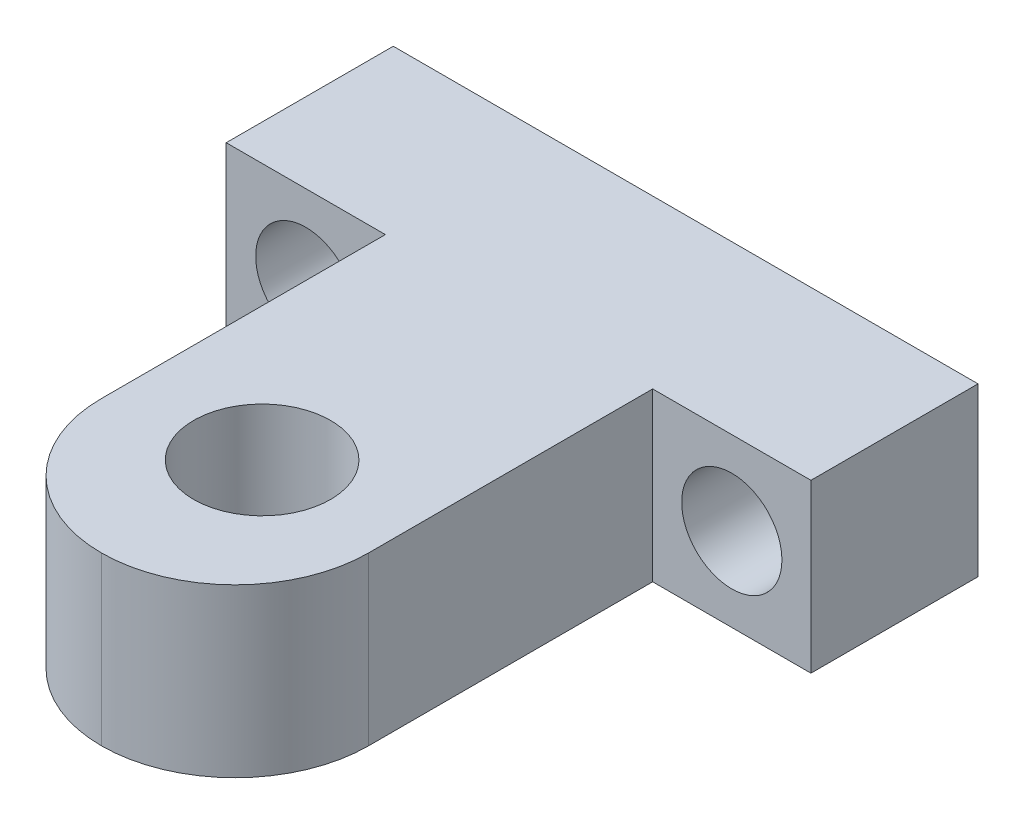
ISO-10303-21;
HEADER;
FILE_DESCRIPTION(('STEP AP214'),'2;1');
FILE_NAME('part.step','',(''),(''),'','','');
FILE_SCHEMA(('AUTOMOTIVE_DESIGN { 1 0 10303 214 1 1 1 1 }'));
ENDSEC;
DATA;
#1=APPLICATION_CONTEXT('core data for automotive mechanical design processes');
#2=APPLICATION_PROTOCOL_DEFINITION('international standard','automotive_design',2000,#1);
#3=PRODUCT_CONTEXT('',#1,'mechanical');
#4=PRODUCT('Part','Part','',(#3));
#5=PRODUCT_RELATED_PRODUCT_CATEGORY('part','',(#4));
#6=PRODUCT_DEFINITION_FORMATION('','',#4);
#7=PRODUCT_DEFINITION_CONTEXT('part definition',#1,'design');
#8=PRODUCT_DEFINITION('design','',#6,#7);
#9=PRODUCT_DEFINITION_SHAPE('','',#8);
#10=(LENGTH_UNIT() NAMED_UNIT(*) SI_UNIT(.MILLI.,.METRE.));
#11=(NAMED_UNIT(*) PLANE_ANGLE_UNIT() SI_UNIT($,.RADIAN.));
#12=(NAMED_UNIT(*) SI_UNIT($,.STERADIAN.) SOLID_ANGLE_UNIT());
#13=UNCERTAINTY_MEASURE_WITH_UNIT(LENGTH_MEASURE(1.E-05),#10,'distance_accuracy_value','');
#14=(GEOMETRIC_REPRESENTATION_CONTEXT(3) GLOBAL_UNCERTAINTY_ASSIGNED_CONTEXT((#13)) GLOBAL_UNIT_ASSIGNED_CONTEXT((#10,
#11,#12)) REPRESENTATION_CONTEXT('',''));
#15=CARTESIAN_POINT('',(0.,0.,0.));
#16=DIRECTION('',(0.,0.,1.));
#17=DIRECTION('',(1.,0.,0.));
#18=AXIS2_PLACEMENT_3D('',#15,#16,#17);
#19=CARTESIAN_POINT('',(12.7099393053223,5.63525769972012,312.507646495262));
#20=DIRECTION('',(0.,0.,1.));
#21=DIRECTION('',(1.,0.,0.));
#22=AXIS2_PLACEMENT_3D('',#19,#20,#21);
#23=CYLINDRICAL_SURFACE('',#22,1.7);
#24=CARTESIAN_POINT('',(12.7099393053223,5.63525769972012,315.507646495262));
#25=DIRECTION('',(0.,0.,1.));
#26=DIRECTION('',(1.,0.,0.));
#27=AXIS2_PLACEMENT_3D('',#24,#25,#26);
#28=CIRCLE('',#27,1.7);
#29=CARTESIAN_POINT('',(14.4099393053223,5.63525769972012,315.507646495262));
#30=VERTEX_POINT('',#29);
#31=EDGE_CURVE('E190',#30,#30,#28,.T.);
#32=CARTESIAN_POINT('',(12.7099393053223,5.63525769972012,319.507646495262));
#33=DIRECTION('',(0.,0.,1.));
#34=DIRECTION('',(1.,0.,0.));
#35=AXIS2_PLACEMENT_3D('',#32,#33,#34);
#36=CIRCLE('',#35,1.7);
#37=CARTESIAN_POINT('',(14.4099393053223,5.63525769972012,319.507646495262));
#38=VERTEX_POINT('',#37);
#39=EDGE_CURVE('E220',#38,#38,#36,.T.);
#40=CARTESIAN_POINT('',(14.4099393053223,5.63525769972012,315.507646495262));
#41=CARTESIAN_POINT('',(14.4099393053223,5.63525769972012,315.549313161929));
#42=CARTESIAN_POINT('',(14.4099393053223,5.63525769972012,315.590979828596));
#43=CARTESIAN_POINT('',(14.4099393053223,5.63525769972012,315.674313161929));
#44=CARTESIAN_POINT('',(14.4099393053223,5.63525769972012,315.715979828596));
#45=CARTESIAN_POINT('',(14.4099393053223,5.63525769972012,315.799313161929));
#46=CARTESIAN_POINT('',(14.4099393053223,5.63525769972012,315.840979828596));
#47=CARTESIAN_POINT('',(14.4099393053223,5.63525769972012,315.924313161929));
#48=CARTESIAN_POINT('',(14.4099393053223,5.63525769972012,315.965979828596));
#49=CARTESIAN_POINT('',(14.4099393053223,5.63525769972012,316.049313161929));
#50=CARTESIAN_POINT('',(14.4099393053223,5.63525769972012,316.090979828596));
#51=CARTESIAN_POINT('',(14.4099393053223,5.63525769972012,316.174313161929));
#52=CARTESIAN_POINT('',(14.4099393053223,5.63525769972012,316.215979828596));
#53=CARTESIAN_POINT('',(14.4099393053223,5.63525769972012,316.299313161929));
#54=CARTESIAN_POINT('',(14.4099393053223,5.63525769972012,316.340979828596));
#55=CARTESIAN_POINT('',(14.4099393053223,5.63525769972012,316.424313161929));
#56=CARTESIAN_POINT('',(14.4099393053223,5.63525769972012,316.465979828596));
#57=CARTESIAN_POINT('',(14.4099393053223,5.63525769972012,316.549313161929));
#58=CARTESIAN_POINT('',(14.4099393053223,5.63525769972012,316.590979828596));
#59=CARTESIAN_POINT('',(14.4099393053223,5.63525769972012,316.674313161929));
#60=CARTESIAN_POINT('',(14.4099393053223,5.63525769972012,316.715979828596));
#61=CARTESIAN_POINT('',(14.4099393053223,5.63525769972012,316.799313161929));
#62=CARTESIAN_POINT('',(14.4099393053223,5.63525769972012,316.840979828596));
#63=CARTESIAN_POINT('',(14.4099393053223,5.63525769972012,316.924313161929));
#64=CARTESIAN_POINT('',(14.4099393053223,5.63525769972012,316.965979828596));
#65=CARTESIAN_POINT('',(14.4099393053223,5.63525769972012,317.049313161929));
#66=CARTESIAN_POINT('',(14.4099393053223,5.63525769972012,317.090979828596));
#67=CARTESIAN_POINT('',(14.4099393053223,5.63525769972012,317.174313161929));
#68=CARTESIAN_POINT('',(14.4099393053223,5.63525769972012,317.215979828596));
#69=CARTESIAN_POINT('',(14.4099393053223,5.63525769972012,317.299313161929));
#70=CARTESIAN_POINT('',(14.4099393053223,5.63525769972012,317.340979828596));
#71=CARTESIAN_POINT('',(14.4099393053223,5.63525769972012,317.424313161929));
#72=CARTESIAN_POINT('',(14.4099393053223,5.63525769972012,317.465979828596));
#73=CARTESIAN_POINT('',(14.4099393053223,5.63525769972012,317.549313161929));
#74=CARTESIAN_POINT('',(14.4099393053223,5.63525769972012,317.590979828596));
#75=CARTESIAN_POINT('',(14.4099393053223,5.63525769972012,317.674313161929));
#76=CARTESIAN_POINT('',(14.4099393053223,5.63525769972012,317.715979828596));
#77=CARTESIAN_POINT('',(14.4099393053223,5.63525769972012,317.799313161929));
#78=CARTESIAN_POINT('',(14.4099393053223,5.63525769972012,317.840979828596));
#79=CARTESIAN_POINT('',(14.4099393053223,5.63525769972012,317.924313161929));
#80=CARTESIAN_POINT('',(14.4099393053223,5.63525769972012,317.965979828596));
#81=CARTESIAN_POINT('',(14.4099393053223,5.63525769972012,318.049313161929));
#82=CARTESIAN_POINT('',(14.4099393053223,5.63525769972012,318.090979828596));
#83=CARTESIAN_POINT('',(14.4099393053223,5.63525769972012,318.174313161929));
#84=CARTESIAN_POINT('',(14.4099393053223,5.63525769972012,318.215979828596));
#85=CARTESIAN_POINT('',(14.4099393053223,5.63525769972012,318.299313161929));
#86=CARTESIAN_POINT('',(14.4099393053223,5.63525769972012,318.340979828596));
#87=CARTESIAN_POINT('',(14.4099393053223,5.63525769972012,318.424313161929));
#88=CARTESIAN_POINT('',(14.4099393053223,5.63525769972012,318.465979828596));
#89=CARTESIAN_POINT('',(14.4099393053223,5.63525769972012,318.549313161929));
#90=CARTESIAN_POINT('',(14.4099393053223,5.63525769972012,318.590979828596));
#91=CARTESIAN_POINT('',(14.4099393053223,5.63525769972012,318.674313161929));
#92=CARTESIAN_POINT('',(14.4099393053223,5.63525769972012,318.715979828596));
#93=CARTESIAN_POINT('',(14.4099393053223,5.63525769972012,318.799313161929));
#94=CARTESIAN_POINT('',(14.4099393053223,5.63525769972012,318.840979828596));
#95=CARTESIAN_POINT('',(14.4099393053223,5.63525769972012,318.924313161929));
#96=CARTESIAN_POINT('',(14.4099393053223,5.63525769972012,318.965979828596));
#97=CARTESIAN_POINT('',(14.4099393053223,5.63525769972012,319.049313161929));
#98=CARTESIAN_POINT('',(14.4099393053223,5.63525769972012,319.090979828596));
#99=CARTESIAN_POINT('',(14.4099393053223,5.63525769972012,319.174313161929));
#100=CARTESIAN_POINT('',(14.4099393053223,5.63525769972012,319.215979828596));
#101=CARTESIAN_POINT('',(14.4099393053223,5.63525769972012,319.299313161929));
#102=CARTESIAN_POINT('',(14.4099393053223,5.63525769972012,319.340979828596));
#103=CARTESIAN_POINT('',(14.4099393053223,5.63525769972012,319.424313161929));
#104=CARTESIAN_POINT('',(14.4099393053223,5.63525769972012,319.465979828596));
#105=CARTESIAN_POINT('',(14.4099393053223,5.63525769972012,319.507646495262));
#106=B_SPLINE_CURVE_WITH_KNOTS('',3,(#40,#41,#42,#43,#44,#45,#46,#47,#48,#49,#50,#51,#52,#53,
#54,#55,#56,#57,#58,#59,#60,#61,#62,#63,#64,#65,#66,#67,#68,#69,#70,#71,#72,#73,#74,#75,#76,#77,
#78,#79,#80,#81,#82,#83,#84,#85,#86,#87,#88,#89,#90,#91,#92,#93,#94,#95,#96,#97,#98,#99,#100,
#101,#102,#103,#104,#105),.UNSPECIFIED.,.F.,.F.,(4,2,2,2,2,2,2,2,2,2,2,2,2,2,2,2,2,2,2,2,2,2,2,
2,2,2,2,2,2,2,2,2,4),(0.,0.125000000000042,0.250000000000028,0.375000000000014,0.5,
0.625000000000042,0.750000000000028,0.875000000000015,1.,1.12500000000004,1.25000000000003,
1.37500000000002,1.5,1.62500000000004,1.75000000000003,1.87500000000002,2.,2.12500000000004,
2.25000000000003,2.37500000000002,2.5,2.62500000000004,2.75000000000003,2.87500000000002,3.,
3.12500000000004,3.25000000000003,3.37500000000002,3.5,3.62500000000004,3.75000000000003,
3.87500000000002,4.),.UNSPECIFIED.);
#107=EDGE_CURVE('BSEAM58',#30,#38,#106,.T.);
#108=ORIENTED_EDGE('',*,*,#31,.F.);
#109=ORIENTED_EDGE('',*,*,#39,.T.);
#110=ORIENTED_EDGE('',*,*,#107,.T.);
#111=ORIENTED_EDGE('',*,*,#107,.F.);
#112=EDGE_LOOP('',(#108,#110,#109,#111));
#113=FACE_BOUND('',#112,.T.);
#114=ADVANCED_FACE('F58',(#113),#23,.F.);
#115=CARTESIAN_POINT('',(-12.7900606946777,5.63525769972012,312.507646495262));
#116=DIRECTION('',(0.,0.,1.));
#117=DIRECTION('',(1.,0.,0.));
#118=AXIS2_PLACEMENT_3D('',#115,#116,#117);
#119=CYLINDRICAL_SURFACE('',#118,1.7);
#120=CARTESIAN_POINT('',(-12.7900606946777,5.63525769972012,315.507646495262));
#121=DIRECTION('',(0.,0.,1.));
#122=DIRECTION('',(1.,0.,0.));
#123=AXIS2_PLACEMENT_3D('',#120,#121,#122);
#124=CIRCLE('',#123,1.7);
#125=CARTESIAN_POINT('',(-11.0900606946777,5.63525769972012,315.507646495262));
#126=VERTEX_POINT('',#125);
#127=EDGE_CURVE('E193',#126,#126,#124,.T.);
#128=CARTESIAN_POINT('',(-12.7900606946777,5.63525769972012,319.507646495262));
#129=DIRECTION('',(0.,0.,1.));
#130=DIRECTION('',(1.,0.,0.));
#131=AXIS2_PLACEMENT_3D('',#128,#129,#130);
#132=CIRCLE('',#131,1.7);
#133=CARTESIAN_POINT('',(-11.0900606946777,5.63525769972012,319.507646495262));
#134=VERTEX_POINT('',#133);
#135=EDGE_CURVE('E290',#134,#134,#132,.F.);
#136=CARTESIAN_POINT('',(-11.0900606946777,5.63525769972012,315.507646495262));
#137=CARTESIAN_POINT('',(-11.0900606946777,5.63525769972012,315.549313161929));
#138=CARTESIAN_POINT('',(-11.0900606946777,5.63525769972012,315.590979828596));
#139=CARTESIAN_POINT('',(-11.0900606946777,5.63525769972012,315.674313161929));
#140=CARTESIAN_POINT('',(-11.0900606946777,5.63525769972012,315.715979828596));
#141=CARTESIAN_POINT('',(-11.0900606946777,5.63525769972012,315.799313161929));
#142=CARTESIAN_POINT('',(-11.0900606946777,5.63525769972012,315.840979828596));
#143=CARTESIAN_POINT('',(-11.0900606946777,5.63525769972012,315.924313161929));
#144=CARTESIAN_POINT('',(-11.0900606946777,5.63525769972012,315.965979828596));
#145=CARTESIAN_POINT('',(-11.0900606946777,5.63525769972012,316.049313161929));
#146=CARTESIAN_POINT('',(-11.0900606946777,5.63525769972012,316.090979828596));
#147=CARTESIAN_POINT('',(-11.0900606946777,5.63525769972012,316.174313161929));
#148=CARTESIAN_POINT('',(-11.0900606946777,5.63525769972012,316.215979828596));
#149=CARTESIAN_POINT('',(-11.0900606946777,5.63525769972012,316.299313161929));
#150=CARTESIAN_POINT('',(-11.0900606946777,5.63525769972012,316.340979828596));
#151=CARTESIAN_POINT('',(-11.0900606946777,5.63525769972012,316.424313161929));
#152=CARTESIAN_POINT('',(-11.0900606946777,5.63525769972012,316.465979828596));
#153=CARTESIAN_POINT('',(-11.0900606946777,5.63525769972012,316.549313161929));
#154=CARTESIAN_POINT('',(-11.0900606946777,5.63525769972012,316.590979828596));
#155=CARTESIAN_POINT('',(-11.0900606946777,5.63525769972012,316.674313161929));
#156=CARTESIAN_POINT('',(-11.0900606946777,5.63525769972012,316.715979828596));
#157=CARTESIAN_POINT('',(-11.0900606946777,5.63525769972012,316.799313161929));
#158=CARTESIAN_POINT('',(-11.0900606946777,5.63525769972012,316.840979828596));
#159=CARTESIAN_POINT('',(-11.0900606946777,5.63525769972012,316.924313161929));
#160=CARTESIAN_POINT('',(-11.0900606946777,5.63525769972012,316.965979828596));
#161=CARTESIAN_POINT('',(-11.0900606946777,5.63525769972012,317.049313161929));
#162=CARTESIAN_POINT('',(-11.0900606946777,5.63525769972012,317.090979828596));
#163=CARTESIAN_POINT('',(-11.0900606946777,5.63525769972012,317.174313161929));
#164=CARTESIAN_POINT('',(-11.0900606946777,5.63525769972012,317.215979828596));
#165=CARTESIAN_POINT('',(-11.0900606946777,5.63525769972012,317.299313161929));
#166=CARTESIAN_POINT('',(-11.0900606946777,5.63525769972012,317.340979828596));
#167=CARTESIAN_POINT('',(-11.0900606946777,5.63525769972012,317.424313161929));
#168=CARTESIAN_POINT('',(-11.0900606946777,5.63525769972012,317.465979828596));
#169=CARTESIAN_POINT('',(-11.0900606946777,5.63525769972012,317.549313161929));
#170=CARTESIAN_POINT('',(-11.0900606946777,5.63525769972012,317.590979828596));
#171=CARTESIAN_POINT('',(-11.0900606946777,5.63525769972012,317.674313161929));
#172=CARTESIAN_POINT('',(-11.0900606946777,5.63525769972012,317.715979828596));
#173=CARTESIAN_POINT('',(-11.0900606946777,5.63525769972012,317.799313161929));
#174=CARTESIAN_POINT('',(-11.0900606946777,5.63525769972012,317.840979828596));
#175=CARTESIAN_POINT('',(-11.0900606946777,5.63525769972012,317.924313161929));
#176=CARTESIAN_POINT('',(-11.0900606946777,5.63525769972012,317.965979828596));
#177=CARTESIAN_POINT('',(-11.0900606946777,5.63525769972012,318.049313161929));
#178=CARTESIAN_POINT('',(-11.0900606946777,5.63525769972012,318.090979828596));
#179=CARTESIAN_POINT('',(-11.0900606946777,5.63525769972012,318.174313161929));
#180=CARTESIAN_POINT('',(-11.0900606946777,5.63525769972012,318.215979828596));
#181=CARTESIAN_POINT('',(-11.0900606946777,5.63525769972012,318.299313161929));
#182=CARTESIAN_POINT('',(-11.0900606946777,5.63525769972012,318.340979828596));
#183=CARTESIAN_POINT('',(-11.0900606946777,5.63525769972012,318.424313161929));
#184=CARTESIAN_POINT('',(-11.0900606946777,5.63525769972012,318.465979828596));
#185=CARTESIAN_POINT('',(-11.0900606946777,5.63525769972012,318.549313161929));
#186=CARTESIAN_POINT('',(-11.0900606946777,5.63525769972012,318.590979828596));
#187=CARTESIAN_POINT('',(-11.0900606946777,5.63525769972012,318.674313161929));
#188=CARTESIAN_POINT('',(-11.0900606946777,5.63525769972012,318.715979828596));
#189=CARTESIAN_POINT('',(-11.0900606946777,5.63525769972012,318.799313161929));
#190=CARTESIAN_POINT('',(-11.0900606946777,5.63525769972012,318.840979828596));
#191=CARTESIAN_POINT('',(-11.0900606946777,5.63525769972012,318.924313161929));
#192=CARTESIAN_POINT('',(-11.0900606946777,5.63525769972012,318.965979828596));
#193=CARTESIAN_POINT('',(-11.0900606946777,5.63525769972012,319.049313161929));
#194=CARTESIAN_POINT('',(-11.0900606946777,5.63525769972012,319.090979828596));
#195=CARTESIAN_POINT('',(-11.0900606946777,5.63525769972012,319.174313161929));
#196=CARTESIAN_POINT('',(-11.0900606946777,5.63525769972012,319.215979828596));
#197=CARTESIAN_POINT('',(-11.0900606946777,5.63525769972012,319.299313161929));
#198=CARTESIAN_POINT('',(-11.0900606946777,5.63525769972012,319.340979828596));
#199=CARTESIAN_POINT('',(-11.0900606946777,5.63525769972012,319.424313161929));
#200=CARTESIAN_POINT('',(-11.0900606946777,5.63525769972012,319.465979828596));
#201=CARTESIAN_POINT('',(-11.0900606946777,5.63525769972012,319.507646495262));
#202=B_SPLINE_CURVE_WITH_KNOTS('',3,(#136,#137,#138,#139,#140,#141,#142,#143,#144,#145,#146,
#147,#148,#149,#150,#151,#152,#153,#154,#155,#156,#157,#158,#159,#160,#161,#162,#163,#164,#165,
#166,#167,#168,#169,#170,#171,#172,#173,#174,#175,#176,#177,#178,#179,#180,#181,#182,#183,#184,
#185,#186,#187,#188,#189,#190,#191,#192,#193,#194,#195,#196,#197,#198,#199,#200,#201),
.UNSPECIFIED.,.F.,.F.,(4,2,2,2,2,2,2,2,2,2,2,2,2,2,2,2,2,2,2,2,2,2,2,2,2,2,2,2,2,2,2,2,4),(0.,
0.125000000000042,0.250000000000028,0.375000000000014,0.5,0.625000000000042,0.750000000000028,
0.875000000000015,1.,1.12500000000004,1.25000000000003,1.37500000000002,1.5,1.62500000000004,
1.75000000000003,1.87500000000002,2.,2.12500000000004,2.25000000000003,2.37500000000002,2.5,
2.62500000000004,2.75000000000003,2.87500000000002,3.,3.12500000000004,3.25000000000003,
3.37500000000002,3.5,3.62500000000004,3.75000000000003,3.87500000000002,4.),.UNSPECIFIED.);
#203=EDGE_CURVE('BSEAM257',#126,#134,#202,.T.);
#204=ORIENTED_EDGE('',*,*,#127,.F.);
#205=ORIENTED_EDGE('',*,*,#135,.F.);
#206=ORIENTED_EDGE('',*,*,#203,.T.);
#207=ORIENTED_EDGE('',*,*,#203,.F.);
#208=EDGE_LOOP('',(#204,#206,#205,#207));
#209=FACE_BOUND('',#208,.T.);
#210=ADVANCED_FACE('F257',(#209),#119,.F.);
#211=CARTESIAN_POINT('',(0.,0.,325.507646495262));
#212=DIRECTION('',(0.,0.,1.));
#213=DIRECTION('',(1.,0.,0.));
#214=AXIS2_PLACEMENT_3D('',#211,#212,#213);
#215=PLANE('',#214);
#216=CARTESIAN_POINT('',(12.7099393053223,5.63525769972012,325.507646495262));
#217=DIRECTION('',(0.,0.,1.));
#218=DIRECTION('',(1.,0.,0.));
#219=AXIS2_PLACEMENT_3D('',#216,#217,#218);
#220=CIRCLE('',#219,3.);
#221=CARTESIAN_POINT('',(15.7099393053223,5.63525769972012,325.507646495262));
#222=VERTEX_POINT('',#221);
#223=EDGE_CURVE('E218',#222,#222,#220,.T.);
#224=ORIENTED_EDGE('',*,*,#223,.F.);
#225=EDGE_LOOP('',(#224));
#226=FACE_BOUND('',#225,.T.);
#227=DIRECTION('',(1.,0.,0.));
#228=VECTOR('',#227,1.);
#229=CARTESIAN_POINT('',(0.,10.6352576997201,325.507646495262));
#230=LINE('',#229,#228);
#231=CARTESIAN_POINT('',(7.97329287021489,10.6352576997201,325.507646495262));
#232=VERTEX_POINT('',#231);
#233=CARTESIAN_POINT('',(17.4465857404298,10.6352576997201,325.507646495262));
#234=VERTEX_POINT('',#233);
#235=EDGE_CURVE('E164',#232,#234,#230,.T.);
#236=ORIENTED_EDGE('',*,*,#235,.F.);
#237=DIRECTION('',(0.,-1.,0.));
#238=VECTOR('',#237,1.);
#239=CARTESIAN_POINT('',(7.97329287021489,0.,325.507646495262));
#240=LINE('',#239,#238);
#241=CARTESIAN_POINT('',(7.97329287021489,0.635257699720115,325.507646495262));
#242=VERTEX_POINT('',#241);
#243=EDGE_CURVE('E160',#232,#242,#240,.T.);
#244=ORIENTED_EDGE('',*,*,#243,.T.);
#245=DIRECTION('',(1.,0.,0.));
#246=VECTOR('',#245,1.);
#247=CARTESIAN_POINT('',(0.,0.635257699720115,325.507646495262));
#248=LINE('',#247,#246);
#249=CARTESIAN_POINT('',(17.4465857404298,0.635257699720115,325.507646495262));
#250=VERTEX_POINT('',#249);
#251=EDGE_CURVE('E148',#242,#250,#248,.T.);
#252=ORIENTED_EDGE('',*,*,#251,.T.);
#253=DIRECTION('',(0.,1.,0.));
#254=VECTOR('',#253,1.);
#255=CARTESIAN_POINT('',(17.4465857404298,0.,325.507646495262));
#256=LINE('',#255,#254);
#257=EDGE_CURVE('E147',#250,#234,#256,.T.);
#258=ORIENTED_EDGE('',*,*,#257,.T.);
#259=EDGE_LOOP('',(#236,#244,#252,#258));
#260=FACE_BOUND('',#259,.T.);
#261=ADVANCED_FACE('F232',(#226,#260),#215,.T.);
#262=CARTESIAN_POINT('',(0.,0.635257699720115,325.507646495262));
#263=DIRECTION('',(0.,1.,0.));
#264=DIRECTION('',(0.,0.,1.));
#265=AXIS2_PLACEMENT_3D('',#262,#263,#264);
#266=PLANE('',#265);
#267=DIRECTION('',(0.,0.,-1.));
#268=VECTOR('',#267,1.);
#269=CARTESIAN_POINT('',(7.97329287021489,0.635257699720115,350.507646495262));
#270=LINE('',#269,#268);
#271=CARTESIAN_POINT('',(7.97329287021489,0.635257699720115,342.507646495262));
#272=VERTEX_POINT('',#271);
#273=EDGE_CURVE('E214',#272,#242,#270,.T.);
#274=ORIENTED_EDGE('',*,*,#273,.F.);
#275=CARTESIAN_POINT('',(-0.0267071297851139,0.635257699720115,342.507646495262));
#276=DIRECTION('',(0.,1.,0.));
#277=DIRECTION('',(0.,0.,1.));
#278=AXIS2_PLACEMENT_3D('',#275,#276,#277);
#279=CIRCLE('',#278,8.);
#280=CARTESIAN_POINT('',(-0.026707129785114,0.635257699720115,350.507646495262));
#281=VERTEX_POINT('',#280);
#282=EDGE_CURVE('E200',#272,#281,#279,.F.);
#283=ORIENTED_EDGE('',*,*,#282,.T.);
#284=CARTESIAN_POINT('',(-0.026707129785114,0.635257699720115,342.507646495262));
#285=DIRECTION('',(0.,1.,0.));
#286=DIRECTION('',(0.,0.,1.));
#287=AXIS2_PLACEMENT_3D('',#284,#285,#286);
#288=CIRCLE('',#287,8.);
#289=CARTESIAN_POINT('',(-8.02670712978511,0.635257699720115,342.507646495262));
#290=VERTEX_POINT('',#289);
#291=EDGE_CURVE('E135',#281,#290,#288,.F.);
#292=ORIENTED_EDGE('',*,*,#291,.T.);
#293=DIRECTION('',(0.,0.,-1.));
#294=VECTOR('',#293,1.);
#295=CARTESIAN_POINT('',(-8.02670712978511,0.635257699720115,350.507646495262));
#296=LINE('',#295,#294);
#297=CARTESIAN_POINT('',(-8.02670712978511,0.635257699720115,325.507646495262));
#298=VERTEX_POINT('',#297);
#299=EDGE_CURVE('E128',#290,#298,#296,.T.);
#300=ORIENTED_EDGE('',*,*,#299,.T.);
#301=CARTESIAN_POINT('',(-17.5534142595702,0.635257699720115,325.507646495262));
#302=VERTEX_POINT('',#301);
#303=EDGE_CURVE('E132',#302,#298,#248,.T.);
#304=ORIENTED_EDGE('',*,*,#303,.F.);
#305=DIRECTION('',(0.,0.,-1.));
#306=VECTOR('',#305,1.);
#307=CARTESIAN_POINT('',(-17.5534142595702,0.635257699720115,325.507646495262));
#308=LINE('',#307,#306);
#309=CARTESIAN_POINT('',(-17.5534142595702,0.635257699720115,315.507646495262));
#310=VERTEX_POINT('',#309);
#311=EDGE_CURVE('E168',#302,#310,#308,.T.);
#312=ORIENTED_EDGE('',*,*,#311,.T.);
#313=DIRECTION('',(1.,0.,0.));
#314=VECTOR('',#313,1.);
#315=CARTESIAN_POINT('',(0.,0.635257699720115,315.507646495262));
#316=LINE('',#315,#314);
#317=CARTESIAN_POINT('',(17.4465857404298,0.635257699720115,315.507646495262));
#318=VERTEX_POINT('',#317);
#319=EDGE_CURVE('E169',#310,#318,#316,.T.);
#320=ORIENTED_EDGE('',*,*,#319,.T.);
#321=DIRECTION('',(0.,0.,-1.));
#322=VECTOR('',#321,1.);
#323=CARTESIAN_POINT('',(17.4465857404298,0.635257699720115,325.507646495262));
#324=LINE('',#323,#322);
#325=EDGE_CURVE('E186',#250,#318,#324,.T.);
#326=ORIENTED_EDGE('',*,*,#325,.F.);
#327=ORIENTED_EDGE('',*,*,#251,.F.);
#328=EDGE_LOOP('',(#274,#283,#292,#300,#304,#312,#320,#326,#327));
#329=FACE_BOUND('',#328,.T.);
#330=ADVANCED_FACE('F131',(#329),#266,.F.);
#331=CARTESIAN_POINT('',(17.4465857404298,0.,325.507646495262));
#332=DIRECTION('',(-1.,0.,0.));
#333=DIRECTION('',(0.,0.,1.));
#334=AXIS2_PLACEMENT_3D('',#331,#332,#333);
#335=PLANE('',#334);
#336=DIRECTION('',(0.,1.,0.));
#337=VECTOR('',#336,1.);
#338=CARTESIAN_POINT('',(17.4465857404298,0.,315.507646495262));
#339=LINE('',#338,#337);
#340=CARTESIAN_POINT('',(17.4465857404298,10.6352576997201,315.507646495262));
#341=VERTEX_POINT('',#340);
#342=EDGE_CURVE('E172',#318,#341,#339,.T.);
#343=ORIENTED_EDGE('',*,*,#342,.T.);
#344=DIRECTION('',(0.,0.,-1.));
#345=VECTOR('',#344,1.);
#346=CARTESIAN_POINT('',(17.4465857404298,10.6352576997201,325.507646495262));
#347=LINE('',#346,#345);
#348=EDGE_CURVE('E184',#234,#341,#347,.T.);
#349=ORIENTED_EDGE('',*,*,#348,.F.);
#350=ORIENTED_EDGE('',*,*,#257,.F.);
#351=ORIENTED_EDGE('',*,*,#325,.T.);
#352=EDGE_LOOP('',(#343,#349,#350,#351));
#353=FACE_BOUND('',#352,.T.);
#354=ADVANCED_FACE('F237',(#353),#335,.F.);
#355=CARTESIAN_POINT('',(0.,10.6352576997201,325.507646495262));
#356=DIRECTION('',(0.,1.,0.));
#357=DIRECTION('',(0.,0.,1.));
#358=AXIS2_PLACEMENT_3D('',#355,#356,#357);
#359=PLANE('',#358);
#360=CARTESIAN_POINT('',(-0.0340554057802755,10.6352576997201,340.877646495262));
#361=DIRECTION('',(0.,1.,0.));
#362=DIRECTION('',(0.,0.,1.));
#363=AXIS2_PLACEMENT_3D('',#360,#361,#362);
#364=CIRCLE('',#363,4.09999999999999);
#365=CARTESIAN_POINT('',(-0.0340554057802755,10.6352576997201,344.977646495262));
#366=VERTEX_POINT('',#365);
#367=EDGE_CURVE('E154',#366,#366,#364,.T.);
#368=ORIENTED_EDGE('',*,*,#367,.F.);
#369=EDGE_LOOP('',(#368));
#370=FACE_BOUND('',#369,.T.);
#371=CARTESIAN_POINT('',(-0.0267071297851158,10.6352576997201,342.507646495262));
#372=DIRECTION('',(0.,1.,0.));
#373=DIRECTION('',(0.,0.,1.));
#374=AXIS2_PLACEMENT_3D('',#371,#372,#373);
#375=CIRCLE('',#374,8.);
#376=CARTESIAN_POINT('',(-8.02670712978512,10.6352576997201,342.507646495262));
#377=VERTEX_POINT('',#376);
#378=CARTESIAN_POINT('',(-0.0267071297851158,10.6352576997201,350.507646495262));
#379=VERTEX_POINT('',#378);
#380=EDGE_CURVE('E74',#377,#379,#375,.T.);
#381=ORIENTED_EDGE('',*,*,#380,.T.);
#382=CARTESIAN_POINT('',(-0.0267071297851122,10.6352576997201,342.507646495262));
#383=DIRECTION('',(0.,1.,0.));
#384=DIRECTION('',(0.,0.,1.));
#385=AXIS2_PLACEMENT_3D('',#382,#383,#384);
#386=CIRCLE('',#385,8.);
#387=CARTESIAN_POINT('',(7.97329287021489,10.6352576997201,342.507646495262));
#388=VERTEX_POINT('',#387);
#389=EDGE_CURVE('E67',#379,#388,#386,.T.);
#390=ORIENTED_EDGE('',*,*,#389,.T.);
#391=DIRECTION('',(0.,0.,-1.));
#392=VECTOR('',#391,1.);
#393=CARTESIAN_POINT('',(7.97329287021489,10.6352576997201,350.507646495262));
#394=LINE('',#393,#392);
#395=EDGE_CURVE('E158',#388,#232,#394,.T.);
#396=ORIENTED_EDGE('',*,*,#395,.T.);
#397=ORIENTED_EDGE('',*,*,#235,.T.);
#398=ORIENTED_EDGE('',*,*,#348,.T.);
#399=DIRECTION('',(1.,0.,0.));
#400=VECTOR('',#399,1.);
#401=CARTESIAN_POINT('',(0.,10.6352576997201,315.507646495262));
#402=LINE('',#401,#400);
#403=CARTESIAN_POINT('',(-17.5534142595702,10.6352576997201,315.507646495262));
#404=VERTEX_POINT('',#403);
#405=EDGE_CURVE('E175',#404,#341,#402,.T.);
#406=ORIENTED_EDGE('',*,*,#405,.F.);
#407=DIRECTION('',(0.,0.,-1.));
#408=VECTOR('',#407,1.);
#409=CARTESIAN_POINT('',(-17.5534142595702,10.6352576997201,325.507646495262));
#410=LINE('',#409,#408);
#411=CARTESIAN_POINT('',(-17.5534142595702,10.6352576997201,325.507646495262));
#412=VERTEX_POINT('',#411);
#413=EDGE_CURVE('E182',#412,#404,#410,.T.);
#414=ORIENTED_EDGE('',*,*,#413,.F.);
#415=CARTESIAN_POINT('',(-8.02670712978511,10.6352576997201,325.507646495262));
#416=VERTEX_POINT('',#415);
#417=EDGE_CURVE('E165',#412,#416,#230,.T.);
#418=ORIENTED_EDGE('',*,*,#417,.T.);
#419=DIRECTION('',(0.,0.,-1.));
#420=VECTOR('',#419,1.);
#421=CARTESIAN_POINT('',(-8.02670712978512,10.6352576997201,350.507646495262));
#422=LINE('',#421,#420);
#423=EDGE_CURVE('E137',#377,#416,#422,.T.);
#424=ORIENTED_EDGE('',*,*,#423,.F.);
#425=EDGE_LOOP('',(#381,#390,#396,#397,#398,#406,#414,#418,#424));
#426=FACE_BOUND('',#425,.T.);
#427=ADVANCED_FACE('F205',(#370,#426),#359,.T.);
#428=CARTESIAN_POINT('',(-17.5534142595702,0.,325.507646495262));
#429=DIRECTION('',(-1.,0.,0.));
#430=DIRECTION('',(0.,-1.,0.));
#431=AXIS2_PLACEMENT_3D('',#428,#429,#430);
#432=PLANE('',#431);
#433=DIRECTION('',(0.,1.,0.));
#434=VECTOR('',#433,1.);
#435=CARTESIAN_POINT('',(-17.5534142595702,0.,315.507646495262));
#436=LINE('',#435,#434);
#437=EDGE_CURVE('E178',#310,#404,#436,.T.);
#438=ORIENTED_EDGE('',*,*,#437,.F.);
#439=ORIENTED_EDGE('',*,*,#311,.F.);
#440=DIRECTION('',(0.,1.,0.));
#441=VECTOR('',#440,1.);
#442=CARTESIAN_POINT('',(-17.5534142595702,0.,325.507646495262));
#443=LINE('',#442,#441);
#444=EDGE_CURVE('E146',#302,#412,#443,.T.);
#445=ORIENTED_EDGE('',*,*,#444,.T.);
#446=ORIENTED_EDGE('',*,*,#413,.T.);
#447=EDGE_LOOP('',(#438,#439,#445,#446));
#448=FACE_BOUND('',#447,.T.);
#449=ADVANCED_FACE('F244',(#448),#432,.T.);
#450=CARTESIAN_POINT('',(-12.7900606946777,5.63525769972012,325.507646495262));
#451=DIRECTION('',(0.,0.,1.));
#452=DIRECTION('',(1.,0.,0.));
#453=AXIS2_PLACEMENT_3D('',#450,#451,#452);
#454=CIRCLE('',#453,3.);
#455=CARTESIAN_POINT('',(-9.79006069467768,5.63525769972012,325.507646495262));
#456=VERTEX_POINT('',#455);
#457=EDGE_CURVE('E292',#456,#456,#454,.T.);
#458=ORIENTED_EDGE('',*,*,#457,.F.);
#459=EDGE_LOOP('',(#458));
#460=FACE_BOUND('',#459,.T.);
#461=DIRECTION('',(0.,-1.,0.));
#462=VECTOR('',#461,1.);
#463=CARTESIAN_POINT('',(-8.02670712978512,10.6352576997201,325.507646495262));
#464=LINE('',#463,#462);
#465=EDGE_CURVE('E138',#416,#298,#464,.T.);
#466=ORIENTED_EDGE('',*,*,#465,.F.);
#467=ORIENTED_EDGE('',*,*,#417,.F.);
#468=ORIENTED_EDGE('',*,*,#444,.F.);
#469=ORIENTED_EDGE('',*,*,#303,.T.);
#470=EDGE_LOOP('',(#466,#467,#468,#469));
#471=FACE_BOUND('',#470,.T.);
#472=ADVANCED_FACE('F142',(#460,#471),#215,.T.);
#473=CARTESIAN_POINT('',(0.,0.,315.507646495262));
#474=DIRECTION('',(0.,0.,1.));
#475=DIRECTION('',(1.,0.,0.));
#476=AXIS2_PLACEMENT_3D('',#473,#474,#475);
#477=PLANE('',#476);
#478=ORIENTED_EDGE('',*,*,#127,.T.);
#479=EDGE_LOOP('',(#478));
#480=FACE_BOUND('',#479,.T.);
#481=ORIENTED_EDGE('',*,*,#31,.T.);
#482=EDGE_LOOP('',(#481));
#483=FACE_BOUND('',#482,.T.);
#484=ORIENTED_EDGE('',*,*,#319,.F.);
#485=ORIENTED_EDGE('',*,*,#437,.T.);
#486=ORIENTED_EDGE('',*,*,#405,.T.);
#487=ORIENTED_EDGE('',*,*,#342,.F.);
#488=EDGE_LOOP('',(#484,#485,#486,#487));
#489=FACE_BOUND('',#488,.T.);
#490=ADVANCED_FACE('F242',(#480,#483,#489),#477,.F.);
#491=CARTESIAN_POINT('',(7.97329287021489,0.,350.507646495262));
#492=DIRECTION('',(1.,0.,0.));
#493=DIRECTION('',(0.,1.,0.));
#494=AXIS2_PLACEMENT_3D('',#491,#492,#493);
#495=PLANE('',#494);
#496=ORIENTED_EDGE('',*,*,#395,.F.);
#497=DIRECTION('',(0.,-1.,0.));
#498=VECTOR('',#497,1.);
#499=CARTESIAN_POINT('',(7.97329287021489,0.,342.507646495262));
#500=LINE('',#499,#498);
#501=EDGE_CURVE('E189',#388,#272,#500,.T.);
#502=ORIENTED_EDGE('',*,*,#501,.T.);
#503=ORIENTED_EDGE('',*,*,#273,.T.);
#504=ORIENTED_EDGE('',*,*,#243,.F.);
#505=EDGE_LOOP('',(#496,#502,#503,#504));
#506=FACE_BOUND('',#505,.T.);
#507=ADVANCED_FACE('F212',(#506),#495,.T.);
#508=CARTESIAN_POINT('',(-8.02670712978512,10.6352576997201,350.507646495262));
#509=DIRECTION('',(1.,0.,0.));
#510=DIRECTION('',(0.,1.,0.));
#511=AXIS2_PLACEMENT_3D('',#508,#509,#510);
#512=PLANE('',#511);
#513=ORIENTED_EDGE('',*,*,#299,.F.);
#514=DIRECTION('',(0.,-1.,0.));
#515=VECTOR('',#514,1.);
#516=CARTESIAN_POINT('',(-8.02670712978512,10.6352576997201,342.507646495262));
#517=LINE('',#516,#515);
#518=EDGE_CURVE('E12',#290,#377,#517,.F.);
#519=ORIENTED_EDGE('',*,*,#518,.T.);
#520=ORIENTED_EDGE('',*,*,#423,.T.);
#521=ORIENTED_EDGE('',*,*,#465,.T.);
#522=EDGE_LOOP('',(#513,#519,#520,#521));
#523=FACE_BOUND('',#522,.T.);
#524=ADVANCED_FACE('F150',(#523),#512,.F.);
#525=CARTESIAN_POINT('',(199.76594459395,2.67551707271912,340.877646495263));
#526=DIRECTION('',(0.,-1.,0.));
#527=DIRECTION('',(0.861583910628245,0.,-0.507615174070418));
#528=AXIS2_PLACEMENT_3D('',#525,#526,#527);
#529=PLANE('',#528);
#530=CARTESIAN_POINT('',(-0.0340554057802755,2.67551707272052,340.877646495262));
#531=DIRECTION('',(0.,-1.,0.));
#532=DIRECTION('',(1.,0.,0.));
#533=AXIS2_PLACEMENT_3D('',#530,#531,#532);
#534=CIRCLE('',#533,4.09999999999999);
#535=CARTESIAN_POINT('',(4.06594459421972,2.67551707272049,340.877646495262));
#536=VERTEX_POINT('',#535);
#537=EDGE_CURVE('E151',#536,#536,#534,.F.);
#538=ORIENTED_EDGE('',*,*,#537,.T.);
#539=EDGE_LOOP('',(#538));
#540=FACE_BOUND('',#539,.T.);
#541=ADVANCED_FACE('F273',(#540),#529,.F.);
#542=CARTESIAN_POINT('',(-0.0340554057802755,-8.92103413873884,340.877646495262));
#543=DIRECTION('',(0.,1.,0.));
#544=DIRECTION('',(0.,0.,1.));
#545=AXIS2_PLACEMENT_3D('',#542,#543,#544);
#546=CYLINDRICAL_SURFACE('',#545,4.09999999999999);
#547=ORIENTED_EDGE('',*,*,#367,.T.);
#548=EDGE_LOOP('',(#547));
#549=FACE_BOUND('',#548,.T.);
#550=ORIENTED_EDGE('',*,*,#537,.F.);
#551=EDGE_LOOP('',(#550));
#552=FACE_BOUND('',#551,.T.);
#553=ADVANCED_FACE('F269',(#549,#552),#546,.F.);
#554=CARTESIAN_POINT('',(-12.7900606946777,5.63525769972012,319.507646495262));
#555=DIRECTION('',(0.,0.,1.));
#556=DIRECTION('',(1.,0.,0.));
#557=AXIS2_PLACEMENT_3D('',#554,#555,#556);
#558=CYLINDRICAL_SURFACE('',#557,3.);
#559=CARTESIAN_POINT('',(-12.7900606946777,5.63525769972012,319.507646495262));
#560=DIRECTION('',(0.,0.,1.));
#561=DIRECTION('',(1.,0.,0.));
#562=AXIS2_PLACEMENT_3D('',#559,#560,#561);
#563=CIRCLE('',#562,3.);
#564=CARTESIAN_POINT('',(-9.79006069467768,5.63525769972012,319.507646495262));
#565=VERTEX_POINT('',#564);
#566=EDGE_CURVE('E194',#565,#565,#563,.T.);
#567=ORIENTED_EDGE('',*,*,#566,.F.);
#568=EDGE_LOOP('',(#567));
#569=FACE_BOUND('',#568,.T.);
#570=ORIENTED_EDGE('',*,*,#457,.T.);
#571=EDGE_LOOP('',(#570));
#572=FACE_BOUND('',#571,.T.);
#573=ADVANCED_FACE('F272',(#569,#572),#558,.F.);
#574=CARTESIAN_POINT('',(0.,0.,319.507646495262));
#575=DIRECTION('',(0.,0.,1.));
#576=DIRECTION('',(1.,0.,0.));
#577=AXIS2_PLACEMENT_3D('',#574,#575,#576);
#578=PLANE('',#577);
#579=ORIENTED_EDGE('',*,*,#135,.T.);
#580=EDGE_LOOP('',(#579));
#581=FACE_BOUND('',#580,.T.);
#582=ORIENTED_EDGE('',*,*,#566,.T.);
#583=EDGE_LOOP('',(#582));
#584=FACE_BOUND('',#583,.T.);
#585=ADVANCED_FACE('F307',(#581,#584),#578,.T.);
#586=CARTESIAN_POINT('',(12.7099393053223,5.63525769972012,319.507646495262));
#587=DIRECTION('',(0.,0.,1.));
#588=DIRECTION('',(1.,0.,0.));
#589=AXIS2_PLACEMENT_3D('',#586,#587,#588);
#590=CYLINDRICAL_SURFACE('',#589,3.);
#591=CARTESIAN_POINT('',(12.7099393053223,5.63525769972012,319.507646495262));
#592=DIRECTION('',(0.,0.,1.));
#593=DIRECTION('',(1.,0.,0.));
#594=AXIS2_PLACEMENT_3D('',#591,#592,#593);
#595=CIRCLE('',#594,3.);
#596=CARTESIAN_POINT('',(15.7099393053223,5.63525769972012,319.507646495262));
#597=VERTEX_POINT('',#596);
#598=EDGE_CURVE('E225',#597,#597,#595,.T.);
#599=ORIENTED_EDGE('',*,*,#598,.F.);
#600=EDGE_LOOP('',(#599));
#601=FACE_BOUND('',#600,.T.);
#602=ORIENTED_EDGE('',*,*,#223,.T.);
#603=EDGE_LOOP('',(#602));
#604=FACE_BOUND('',#603,.T.);
#605=ADVANCED_FACE('F305',(#601,#604),#590,.F.);
#606=CARTESIAN_POINT('',(0.,0.,319.507646495262));
#607=DIRECTION('',(0.,0.,1.));
#608=DIRECTION('',(1.,0.,0.));
#609=AXIS2_PLACEMENT_3D('',#606,#607,#608);
#610=PLANE('',#609);
#611=ORIENTED_EDGE('',*,*,#39,.F.);
#612=EDGE_LOOP('',(#611));
#613=FACE_BOUND('',#612,.T.);
#614=ORIENTED_EDGE('',*,*,#598,.T.);
#615=EDGE_LOOP('',(#614));
#616=FACE_BOUND('',#615,.T.);
#617=ADVANCED_FACE('F303',(#613,#616),#610,.T.);
#618=CARTESIAN_POINT('',(-0.0267071297851139,0.,342.507646495262));
#619=DIRECTION('',(0.,1.,0.));
#620=DIRECTION('',(-1.,0.,0.));
#621=AXIS2_PLACEMENT_3D('',#618,#619,#620);
#622=CYLINDRICAL_SURFACE('',#621,8.);
#623=DIRECTION('',(0.,-1.,0.));
#624=VECTOR('',#623,1.);
#625=CARTESIAN_POINT('',(-0.026707129785114,0.635257699720117,350.507646495262));
#626=LINE('',#625,#624);
#627=EDGE_CURVE('E62',#379,#281,#626,.T.);
#628=ORIENTED_EDGE('',*,*,#627,.F.);
#629=ORIENTED_EDGE('',*,*,#380,.F.);
#630=ORIENTED_EDGE('',*,*,#518,.F.);
#631=ORIENTED_EDGE('',*,*,#291,.F.);
#632=EDGE_LOOP('',(#628,#629,#630,#631));
#633=FACE_BOUND('',#632,.T.);
#634=ADVANCED_FACE('F60',(#633),#622,.T.);
#635=CARTESIAN_POINT('',(-0.026707129785114,0.,342.507646495262));
#636=DIRECTION('',(0.,-1.,0.));
#637=DIRECTION('',(1.,0.,0.));
#638=AXIS2_PLACEMENT_3D('',#635,#636,#637);
#639=CYLINDRICAL_SURFACE('',#638,8.);
#640=ORIENTED_EDGE('',*,*,#389,.F.);
#641=ORIENTED_EDGE('',*,*,#627,.T.);
#642=ORIENTED_EDGE('',*,*,#282,.F.);
#643=ORIENTED_EDGE('',*,*,#501,.F.);
#644=EDGE_LOOP('',(#640,#641,#642,#643));
#645=FACE_BOUND('',#644,.T.);
#646=ADVANCED_FACE('F215',(#645),#639,.T.);
#647=CLOSED_SHELL('',(#114,#210,#261,#330,#354,#427,#449,#472,#490,#507,#524,#541,#553,#573,
#585,#605,#617,#634,#646));
#648=MANIFOLD_SOLID_BREP('B2',#647);
#649=ADVANCED_BREP_SHAPE_REPRESENTATION('',(#18,#648),#14);
#650=SHAPE_DEFINITION_REPRESENTATION(#9,#649);
ENDSEC;
END-ISO-10303-21;
